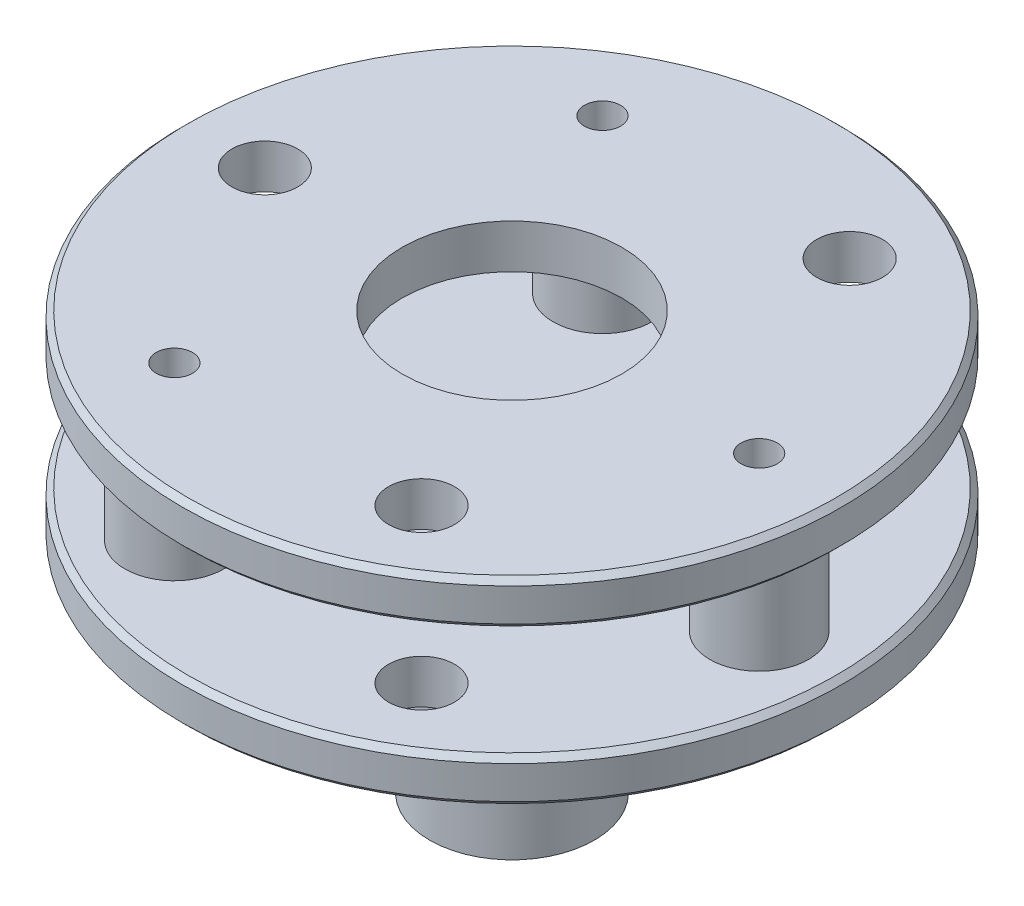
ISO-10303-21;
HEADER;
FILE_DESCRIPTION(('STEP AP214'),'2;1');
FILE_NAME('part.step','',(''),(''),'','','');
FILE_SCHEMA(('AUTOMOTIVE_DESIGN { 1 0 10303 214 1 1 1 1 }'));
ENDSEC;
DATA;
#1=APPLICATION_CONTEXT('core data for automotive mechanical design processes');
#2=APPLICATION_PROTOCOL_DEFINITION('international standard','automotive_design',2000,#1);
#3=PRODUCT_CONTEXT('',#1,'mechanical');
#4=PRODUCT('Part','Part','',(#3));
#5=PRODUCT_RELATED_PRODUCT_CATEGORY('part','',(#4));
#6=PRODUCT_DEFINITION_FORMATION('','',#4);
#7=PRODUCT_DEFINITION_CONTEXT('part definition',#1,'design');
#8=PRODUCT_DEFINITION('design','',#6,#7);
#9=PRODUCT_DEFINITION_SHAPE('','',#8);
#10=(LENGTH_UNIT() NAMED_UNIT(*) SI_UNIT(.MILLI.,.METRE.));
#11=(NAMED_UNIT(*) PLANE_ANGLE_UNIT() SI_UNIT($,.RADIAN.));
#12=(NAMED_UNIT(*) SI_UNIT($,.STERADIAN.) SOLID_ANGLE_UNIT());
#13=UNCERTAINTY_MEASURE_WITH_UNIT(LENGTH_MEASURE(1.E-05),#10,'distance_accuracy_value','');
#14=(GEOMETRIC_REPRESENTATION_CONTEXT(3) GLOBAL_UNCERTAINTY_ASSIGNED_CONTEXT((#13)) GLOBAL_UNIT_ASSIGNED_CONTEXT((#10,
#11,#12)) REPRESENTATION_CONTEXT('',''));
#15=CARTESIAN_POINT('',(0.,0.,0.));
#16=DIRECTION('',(0.,0.,1.));
#17=DIRECTION('',(1.,0.,0.));
#18=AXIS2_PLACEMENT_3D('',#15,#16,#17);
#19=CARTESIAN_POINT('',(-22.5,76.,-38.971143));
#20=DIRECTION('',(0.,-1.,0.));
#21=DIRECTION('',(0.,0.,-1.));
#22=AXIS2_PLACEMENT_3D('',#19,#20,#21);
#23=CYLINDRICAL_SURFACE('',#22,9.);
#24=CARTESIAN_POINT('',(-22.5,48.,-38.971143));
#25=DIRECTION('',(0.,1.,0.));
#26=DIRECTION('',(0.,0.,1.));
#27=AXIS2_PLACEMENT_3D('',#24,#25,#26);
#28=CIRCLE('',#27,9.);
#29=CARTESIAN_POINT('',(-22.5,48.,-29.971143));
#30=VERTEX_POINT('',#29);
#31=EDGE_CURVE('E114',#30,#30,#28,.F.);
#32=ORIENTED_EDGE('',*,*,#31,.F.);
#33=EDGE_LOOP('',(#32));
#34=FACE_BOUND('',#33,.T.);
#35=CARTESIAN_POINT('',(-22.5,68.,-38.971143));
#36=DIRECTION('',(0.,1.,0.));
#37=DIRECTION('',(0.,0.,1.));
#38=AXIS2_PLACEMENT_3D('',#35,#36,#37);
#39=CIRCLE('',#38,9.);
#40=CARTESIAN_POINT('',(-22.5,68.,-29.971143));
#41=VERTEX_POINT('',#40);
#42=EDGE_CURVE('E100',#41,#41,#39,.T.);
#43=ORIENTED_EDGE('',*,*,#42,.F.);
#44=EDGE_LOOP('',(#43));
#45=FACE_BOUND('',#44,.T.);
#46=ADVANCED_FACE('F51',(#34,#45),#23,.T.);
#47=CARTESIAN_POINT('',(-22.5,76.,38.971143));
#48=DIRECTION('',(0.,-1.,0.));
#49=DIRECTION('',(0.,0.,-1.));
#50=AXIS2_PLACEMENT_3D('',#47,#48,#49);
#51=CYLINDRICAL_SURFACE('',#50,9.);
#52=CARTESIAN_POINT('',(-22.5,48.,38.971143));
#53=DIRECTION('',(0.,1.,0.));
#54=DIRECTION('',(0.,0.,1.));
#55=AXIS2_PLACEMENT_3D('',#52,#53,#54);
#56=CIRCLE('',#55,9.);
#57=CARTESIAN_POINT('',(-22.5,48.,47.971143));
#58=VERTEX_POINT('',#57);
#59=EDGE_CURVE('E110',#58,#58,#56,.F.);
#60=ORIENTED_EDGE('',*,*,#59,.F.);
#61=EDGE_LOOP('',(#60));
#62=FACE_BOUND('',#61,.T.);
#63=CARTESIAN_POINT('',(-22.5,68.,38.971143));
#64=DIRECTION('',(0.,1.,0.));
#65=DIRECTION('',(0.,0.,1.));
#66=AXIS2_PLACEMENT_3D('',#63,#64,#65);
#67=CIRCLE('',#66,9.);
#68=CARTESIAN_POINT('',(-22.5,68.,47.971143));
#69=VERTEX_POINT('',#68);
#70=EDGE_CURVE('E105',#69,#69,#67,.T.);
#71=ORIENTED_EDGE('',*,*,#70,.F.);
#72=EDGE_LOOP('',(#71));
#73=FACE_BOUND('',#72,.T.);
#74=ADVANCED_FACE('F230',(#62,#73),#51,.T.);
#75=CARTESIAN_POINT('',(45.,76.,0.));
#76=DIRECTION('',(0.,-1.,0.));
#77=DIRECTION('',(0.,0.,-1.));
#78=AXIS2_PLACEMENT_3D('',#75,#76,#77);
#79=CYLINDRICAL_SURFACE('',#78,9.);
#80=CARTESIAN_POINT('',(45.,48.,0.));
#81=DIRECTION('',(0.,1.,0.));
#82=DIRECTION('',(0.,0.,1.));
#83=AXIS2_PLACEMENT_3D('',#80,#81,#82);
#84=CIRCLE('',#83,9.);
#85=CARTESIAN_POINT('',(45.,48.,9.));
#86=VERTEX_POINT('',#85);
#87=EDGE_CURVE('E106',#86,#86,#84,.F.);
#88=ORIENTED_EDGE('',*,*,#87,.F.);
#89=EDGE_LOOP('',(#88));
#90=FACE_BOUND('',#89,.T.);
#91=CARTESIAN_POINT('',(45.,68.,0.));
#92=DIRECTION('',(0.,1.,0.));
#93=DIRECTION('',(0.,0.,1.));
#94=AXIS2_PLACEMENT_3D('',#91,#92,#93);
#95=CIRCLE('',#94,9.);
#96=CARTESIAN_POINT('',(45.,68.,9.));
#97=VERTEX_POINT('',#96);
#98=EDGE_CURVE('E101',#97,#97,#95,.T.);
#99=ORIENTED_EDGE('',*,*,#98,.F.);
#100=EDGE_LOOP('',(#99));
#101=FACE_BOUND('',#100,.T.);
#102=ADVANCED_FACE('F235',(#90,#101),#79,.T.);
#103=CARTESIAN_POINT('',(0.,48.,0.));
#104=DIRECTION('',(0.,-1.,0.));
#105=DIRECTION('',(0.,0.,-1.));
#106=AXIS2_PLACEMENT_3D('',#103,#104,#105);
#107=CYLINDRICAL_SURFACE('',#106,60.);
#108=CARTESIAN_POINT('',(0.,47.,0.));
#109=DIRECTION('',(0.,1.,0.));
#110=DIRECTION('',(0.,0.,1.));
#111=AXIS2_PLACEMENT_3D('',#108,#109,#110);
#112=CIRCLE('',#111,60.);
#113=CARTESIAN_POINT('',(0.,47.,60.));
#114=VERTEX_POINT('',#113);
#115=EDGE_CURVE('E60',#114,#114,#112,.F.);
#116=ORIENTED_EDGE('',*,*,#115,.T.);
#117=EDGE_LOOP('',(#116));
#118=FACE_BOUND('',#117,.T.);
#119=CARTESIAN_POINT('',(0.,41.,0.));
#120=DIRECTION('',(0.,1.,0.));
#121=DIRECTION('',(0.,0.,1.));
#122=AXIS2_PLACEMENT_3D('',#119,#120,#121);
#123=CIRCLE('',#122,60.);
#124=CARTESIAN_POINT('',(0.,41.,60.));
#125=VERTEX_POINT('',#124);
#126=EDGE_CURVE('E67',#125,#125,#123,.T.);
#127=ORIENTED_EDGE('',*,*,#126,.T.);
#128=EDGE_LOOP('',(#127));
#129=FACE_BOUND('',#128,.T.);
#130=ADVANCED_FACE('F246',(#118,#129),#107,.T.);
#131=CARTESIAN_POINT('',(0.,48.,0.));
#132=DIRECTION('',(0.,1.,0.));
#133=DIRECTION('',(0.,0.,1.));
#134=AXIS2_PLACEMENT_3D('',#131,#132,#133);
#135=PLANE('',#134);
#136=CARTESIAN_POINT('',(0.,48.,0.));
#137=DIRECTION('',(0.,1.,0.));
#138=DIRECTION('',(0.,0.,1.));
#139=AXIS2_PLACEMENT_3D('',#136,#137,#138);
#140=CIRCLE('',#139,59.);
#141=CARTESIAN_POINT('',(0.,48.,59.));
#142=VERTEX_POINT('',#141);
#143=EDGE_CURVE('E74',#142,#142,#140,.T.);
#144=ORIENTED_EDGE('',*,*,#143,.T.);
#145=EDGE_LOOP('',(#144));
#146=FACE_BOUND('',#145,.T.);
#147=CARTESIAN_POINT('',(22.5,48.,38.971143));
#148=DIRECTION('',(0.,1.,0.));
#149=DIRECTION('',(0.,0.,1.));
#150=AXIS2_PLACEMENT_3D('',#147,#148,#149);
#151=CIRCLE('',#150,6.);
#152=CARTESIAN_POINT('',(22.5,48.,44.971143));
#153=VERTEX_POINT('',#152);
#154=EDGE_CURVE('E145',#153,#153,#151,.T.);
#155=ORIENTED_EDGE('',*,*,#154,.F.);
#156=EDGE_LOOP('',(#155));
#157=FACE_BOUND('',#156,.T.);
#158=CARTESIAN_POINT('',(-45.,48.,0.));
#159=DIRECTION('',(0.,1.,0.));
#160=DIRECTION('',(0.,0.,1.));
#161=AXIS2_PLACEMENT_3D('',#158,#159,#160);
#162=CIRCLE('',#161,6.);
#163=CARTESIAN_POINT('',(-45.,48.,6.));
#164=VERTEX_POINT('',#163);
#165=EDGE_CURVE('E163',#164,#164,#162,.T.);
#166=ORIENTED_EDGE('',*,*,#165,.F.);
#167=EDGE_LOOP('',(#166));
#168=FACE_BOUND('',#167,.T.);
#169=CARTESIAN_POINT('',(22.5,48.,-38.971143));
#170=DIRECTION('',(0.,1.,0.));
#171=DIRECTION('',(0.,0.,1.));
#172=AXIS2_PLACEMENT_3D('',#169,#170,#171);
#173=CIRCLE('',#172,6.);
#174=CARTESIAN_POINT('',(22.5,48.,-32.971143));
#175=VERTEX_POINT('',#174);
#176=EDGE_CURVE('E175',#175,#175,#173,.T.);
#177=ORIENTED_EDGE('',*,*,#176,.F.);
#178=EDGE_LOOP('',(#177));
#179=FACE_BOUND('',#178,.T.);
#180=ORIENTED_EDGE('',*,*,#87,.T.);
#181=EDGE_LOOP('',(#180));
#182=FACE_BOUND('',#181,.T.);
#183=ORIENTED_EDGE('',*,*,#59,.T.);
#184=EDGE_LOOP('',(#183));
#185=FACE_BOUND('',#184,.T.);
#186=ORIENTED_EDGE('',*,*,#31,.T.);
#187=EDGE_LOOP('',(#186));
#188=FACE_BOUND('',#187,.T.);
#189=ADVANCED_FACE('F242',(#146,#157,#168,#179,#182,#185,#188),#135,.T.);
#190=CARTESIAN_POINT('',(0.,40.,0.));
#191=DIRECTION('',(0.,1.,0.));
#192=DIRECTION('',(0.,0.,1.));
#193=AXIS2_PLACEMENT_3D('',#190,#191,#192);
#194=PLANE('',#193);
#195=CARTESIAN_POINT('',(0.,40.,0.));
#196=DIRECTION('',(0.,1.,0.));
#197=DIRECTION('',(0.,0.,1.));
#198=AXIS2_PLACEMENT_3D('',#195,#196,#197);
#199=CIRCLE('',#198,59.);
#200=CARTESIAN_POINT('',(0.,40.,59.));
#201=VERTEX_POINT('',#200);
#202=EDGE_CURVE('E10',#201,#201,#199,.F.);
#203=ORIENTED_EDGE('',*,*,#202,.T.);
#204=EDGE_LOOP('',(#203));
#205=FACE_BOUND('',#204,.T.);
#206=CARTESIAN_POINT('',(22.5,40.,38.971143));
#207=DIRECTION('',(0.,1.,0.));
#208=DIRECTION('',(0.,0.,1.));
#209=AXIS2_PLACEMENT_3D('',#206,#207,#208);
#210=CIRCLE('',#209,6.);
#211=CARTESIAN_POINT('',(22.5,40.,44.971143));
#212=VERTEX_POINT('',#211);
#213=EDGE_CURVE('E155',#212,#212,#210,.T.);
#214=ORIENTED_EDGE('',*,*,#213,.T.);
#215=EDGE_LOOP('',(#214));
#216=FACE_BOUND('',#215,.T.);
#217=CARTESIAN_POINT('',(-45.,40.,0.));
#218=DIRECTION('',(0.,1.,0.));
#219=DIRECTION('',(0.,0.,1.));
#220=AXIS2_PLACEMENT_3D('',#217,#218,#219);
#221=CIRCLE('',#220,6.);
#222=CARTESIAN_POINT('',(-45.,40.,6.));
#223=VERTEX_POINT('',#222);
#224=EDGE_CURVE('E167',#223,#223,#221,.T.);
#225=ORIENTED_EDGE('',*,*,#224,.T.);
#226=EDGE_LOOP('',(#225));
#227=FACE_BOUND('',#226,.T.);
#228=CARTESIAN_POINT('',(22.5,40.,-38.971143));
#229=DIRECTION('',(0.,1.,0.));
#230=DIRECTION('',(0.,0.,1.));
#231=AXIS2_PLACEMENT_3D('',#228,#229,#230);
#232=CIRCLE('',#231,6.);
#233=CARTESIAN_POINT('',(22.5,40.,-32.971143));
#234=VERTEX_POINT('',#233);
#235=EDGE_CURVE('E179',#234,#234,#232,.T.);
#236=ORIENTED_EDGE('',*,*,#235,.T.);
#237=EDGE_LOOP('',(#236));
#238=FACE_BOUND('',#237,.T.);
#239=CARTESIAN_POINT('',(45.,40.,0.));
#240=DIRECTION('',(0.,1.,0.));
#241=DIRECTION('',(0.,0.,1.));
#242=AXIS2_PLACEMENT_3D('',#239,#240,#241);
#243=CIRCLE('',#242,3.3);
#244=CARTESIAN_POINT('',(45.,40.,3.3));
#245=VERTEX_POINT('',#244);
#246=EDGE_CURVE('E128',#245,#245,#243,.T.);
#247=ORIENTED_EDGE('',*,*,#246,.T.);
#248=EDGE_LOOP('',(#247));
#249=FACE_BOUND('',#248,.T.);
#250=CARTESIAN_POINT('',(-22.5,40.,38.971143));
#251=DIRECTION('',(0.,1.,0.));
#252=DIRECTION('',(0.,0.,1.));
#253=AXIS2_PLACEMENT_3D('',#250,#251,#252);
#254=CIRCLE('',#253,3.3);
#255=CARTESIAN_POINT('',(-22.5,40.,42.271143));
#256=VERTEX_POINT('',#255);
#257=EDGE_CURVE('E132',#256,#256,#254,.T.);
#258=ORIENTED_EDGE('',*,*,#257,.T.);
#259=EDGE_LOOP('',(#258));
#260=FACE_BOUND('',#259,.T.);
#261=CARTESIAN_POINT('',(-22.5,40.,-38.971143));
#262=DIRECTION('',(0.,1.,0.));
#263=DIRECTION('',(0.,0.,1.));
#264=AXIS2_PLACEMENT_3D('',#261,#262,#263);
#265=CIRCLE('',#264,3.3);
#266=CARTESIAN_POINT('',(-22.5,40.,-35.671143));
#267=VERTEX_POINT('',#266);
#268=EDGE_CURVE('E136',#267,#267,#265,.T.);
#269=ORIENTED_EDGE('',*,*,#268,.T.);
#270=EDGE_LOOP('',(#269));
#271=FACE_BOUND('',#270,.T.);
#272=CARTESIAN_POINT('',(0.,40.,0.));
#273=DIRECTION('',(0.,1.,0.));
#274=DIRECTION('',(0.,0.,1.));
#275=AXIS2_PLACEMENT_3D('',#272,#273,#274);
#276=CIRCLE('',#275,15.);
#277=CARTESIAN_POINT('',(0.,40.,15.));
#278=VERTEX_POINT('',#277);
#279=EDGE_CURVE('E96',#278,#278,#276,.F.);
#280=ORIENTED_EDGE('',*,*,#279,.F.);
#281=EDGE_LOOP('',(#280));
#282=FACE_BOUND('',#281,.T.);
#283=ADVANCED_FACE('F245',(#205,#216,#227,#238,#249,#260,#271,#282),#194,.F.);
#284=CARTESIAN_POINT('',(0.,76.,0.));
#285=DIRECTION('',(0.,-1.,0.));
#286=DIRECTION('',(0.,0.,-1.));
#287=AXIS2_PLACEMENT_3D('',#284,#285,#286);
#288=CYLINDRICAL_SURFACE('',#287,60.);
#289=CARTESIAN_POINT('',(0.,75.,0.));
#290=DIRECTION('',(0.,1.,0.));
#291=DIRECTION('',(0.,0.,1.));
#292=AXIS2_PLACEMENT_3D('',#289,#290,#291);
#293=CIRCLE('',#292,60.);
#294=CARTESIAN_POINT('',(0.,75.,60.));
#295=VERTEX_POINT('',#294);
#296=EDGE_CURVE('E84',#295,#295,#293,.F.);
#297=ORIENTED_EDGE('',*,*,#296,.T.);
#298=EDGE_LOOP('',(#297));
#299=FACE_BOUND('',#298,.T.);
#300=CARTESIAN_POINT('',(0.,69.,0.));
#301=DIRECTION('',(0.,1.,0.));
#302=DIRECTION('',(0.,0.,1.));
#303=AXIS2_PLACEMENT_3D('',#300,#301,#302);
#304=CIRCLE('',#303,60.);
#305=CARTESIAN_POINT('',(0.,69.,60.));
#306=VERTEX_POINT('',#305);
#307=EDGE_CURVE('E88',#306,#306,#304,.T.);
#308=ORIENTED_EDGE('',*,*,#307,.T.);
#309=EDGE_LOOP('',(#308));
#310=FACE_BOUND('',#309,.T.);
#311=ADVANCED_FACE('F250',(#299,#310),#288,.T.);
#312=CARTESIAN_POINT('',(0.,68.,0.));
#313=DIRECTION('',(0.,1.,0.));
#314=DIRECTION('',(0.,0.,1.));
#315=AXIS2_PLACEMENT_3D('',#312,#313,#314);
#316=PLANE('',#315);
#317=CARTESIAN_POINT('',(0.,68.,0.));
#318=DIRECTION('',(0.,1.,0.));
#319=DIRECTION('',(0.,0.,1.));
#320=AXIS2_PLACEMENT_3D('',#317,#318,#319);
#321=CIRCLE('',#320,59.);
#322=CARTESIAN_POINT('',(0.,68.,59.));
#323=VERTEX_POINT('',#322);
#324=EDGE_CURVE('E80',#323,#323,#321,.F.);
#325=ORIENTED_EDGE('',*,*,#324,.T.);
#326=EDGE_LOOP('',(#325));
#327=FACE_BOUND('',#326,.T.);
#328=CARTESIAN_POINT('',(0.,68.,0.));
#329=DIRECTION('',(0.,1.,0.));
#330=DIRECTION('',(0.,0.,1.));
#331=AXIS2_PLACEMENT_3D('',#328,#329,#330);
#332=CIRCLE('',#331,20.);
#333=CARTESIAN_POINT('',(0.,68.,20.));
#334=VERTEX_POINT('',#333);
#335=EDGE_CURVE('E192',#334,#334,#332,.T.);
#336=ORIENTED_EDGE('',*,*,#335,.T.);
#337=EDGE_LOOP('',(#336));
#338=FACE_BOUND('',#337,.T.);
#339=CARTESIAN_POINT('',(22.5,68.,38.971143));
#340=DIRECTION('',(0.,1.,0.));
#341=DIRECTION('',(0.,0.,1.));
#342=AXIS2_PLACEMENT_3D('',#339,#340,#341);
#343=CIRCLE('',#342,6.);
#344=CARTESIAN_POINT('',(22.5,68.,44.971143));
#345=VERTEX_POINT('',#344);
#346=EDGE_CURVE('E159',#345,#345,#343,.T.);
#347=ORIENTED_EDGE('',*,*,#346,.T.);
#348=EDGE_LOOP('',(#347));
#349=FACE_BOUND('',#348,.T.);
#350=CARTESIAN_POINT('',(-45.,68.,0.));
#351=DIRECTION('',(0.,1.,0.));
#352=DIRECTION('',(0.,0.,1.));
#353=AXIS2_PLACEMENT_3D('',#350,#351,#352);
#354=CIRCLE('',#353,6.);
#355=CARTESIAN_POINT('',(-45.,68.,6.));
#356=VERTEX_POINT('',#355);
#357=EDGE_CURVE('E171',#356,#356,#354,.T.);
#358=ORIENTED_EDGE('',*,*,#357,.T.);
#359=EDGE_LOOP('',(#358));
#360=FACE_BOUND('',#359,.T.);
#361=CARTESIAN_POINT('',(22.5,68.,-38.971143));
#362=DIRECTION('',(0.,1.,0.));
#363=DIRECTION('',(0.,0.,1.));
#364=AXIS2_PLACEMENT_3D('',#361,#362,#363);
#365=CIRCLE('',#364,6.);
#366=CARTESIAN_POINT('',(22.5,68.,-32.971143));
#367=VERTEX_POINT('',#366);
#368=EDGE_CURVE('E183',#367,#367,#365,.T.);
#369=ORIENTED_EDGE('',*,*,#368,.T.);
#370=EDGE_LOOP('',(#369));
#371=FACE_BOUND('',#370,.T.);
#372=ORIENTED_EDGE('',*,*,#42,.T.);
#373=EDGE_LOOP('',(#372));
#374=FACE_BOUND('',#373,.T.);
#375=ORIENTED_EDGE('',*,*,#70,.T.);
#376=EDGE_LOOP('',(#375));
#377=FACE_BOUND('',#376,.T.);
#378=ORIENTED_EDGE('',*,*,#98,.T.);
#379=EDGE_LOOP('',(#378));
#380=FACE_BOUND('',#379,.T.);
#381=ADVANCED_FACE('F283',(#327,#338,#349,#360,#371,#374,#377,#380),#316,.F.);
#382=CARTESIAN_POINT('',(45.,76.,0.));
#383=DIRECTION('',(0.,1.,0.));
#384=DIRECTION('',(0.,0.,1.));
#385=AXIS2_PLACEMENT_3D('',#382,#383,#384);
#386=PLANE('',#385);
#387=CARTESIAN_POINT('',(0.,76.,0.));
#388=DIRECTION('',(0.,1.,0.));
#389=DIRECTION('',(0.,0.,1.));
#390=AXIS2_PLACEMENT_3D('',#387,#388,#389);
#391=CIRCLE('',#390,59.);
#392=CARTESIAN_POINT('',(0.,76.,59.));
#393=VERTEX_POINT('',#392);
#394=EDGE_CURVE('E92',#393,#393,#391,.T.);
#395=ORIENTED_EDGE('',*,*,#394,.T.);
#396=EDGE_LOOP('',(#395));
#397=FACE_BOUND('',#396,.T.);
#398=CARTESIAN_POINT('',(0.,76.,0.));
#399=DIRECTION('',(0.,1.,0.));
#400=DIRECTION('',(0.,0.,1.));
#401=AXIS2_PLACEMENT_3D('',#398,#399,#400);
#402=CIRCLE('',#401,20.);
#403=CARTESIAN_POINT('',(0.,76.,20.));
#404=VERTEX_POINT('',#403);
#405=EDGE_CURVE('E199',#404,#404,#402,.T.);
#406=ORIENTED_EDGE('',*,*,#405,.F.);
#407=EDGE_LOOP('',(#406));
#408=FACE_BOUND('',#407,.T.);
#409=CARTESIAN_POINT('',(22.5,76.,38.971143));
#410=DIRECTION('',(0.,1.,0.));
#411=DIRECTION('',(0.,0.,1.));
#412=AXIS2_PLACEMENT_3D('',#409,#410,#411);
#413=CIRCLE('',#412,6.);
#414=CARTESIAN_POINT('',(22.5,76.,44.971143));
#415=VERTEX_POINT('',#414);
#416=EDGE_CURVE('E186',#415,#415,#413,.T.);
#417=ORIENTED_EDGE('',*,*,#416,.F.);
#418=EDGE_LOOP('',(#417));
#419=FACE_BOUND('',#418,.T.);
#420=CARTESIAN_POINT('',(-45.,76.,0.));
#421=DIRECTION('',(0.,1.,0.));
#422=DIRECTION('',(0.,0.,1.));
#423=AXIS2_PLACEMENT_3D('',#420,#421,#422);
#424=CIRCLE('',#423,6.);
#425=CARTESIAN_POINT('',(-45.,76.,6.));
#426=VERTEX_POINT('',#425);
#427=EDGE_CURVE('E191',#426,#426,#424,.T.);
#428=ORIENTED_EDGE('',*,*,#427,.F.);
#429=EDGE_LOOP('',(#428));
#430=FACE_BOUND('',#429,.T.);
#431=CARTESIAN_POINT('',(22.5,76.,-38.971143));
#432=DIRECTION('',(0.,1.,0.));
#433=DIRECTION('',(0.,0.,1.));
#434=AXIS2_PLACEMENT_3D('',#431,#432,#433);
#435=CIRCLE('',#434,6.);
#436=CARTESIAN_POINT('',(22.5,76.,-32.971143));
#437=VERTEX_POINT('',#436);
#438=EDGE_CURVE('E187',#437,#437,#435,.T.);
#439=ORIENTED_EDGE('',*,*,#438,.F.);
#440=EDGE_LOOP('',(#439));
#441=FACE_BOUND('',#440,.T.);
#442=CARTESIAN_POINT('',(45.,76.,0.));
#443=DIRECTION('',(0.,1.,0.));
#444=DIRECTION('',(0.,0.,1.));
#445=AXIS2_PLACEMENT_3D('',#442,#443,#444);
#446=CIRCLE('',#445,3.3);
#447=CARTESIAN_POINT('',(45.,76.,3.3));
#448=VERTEX_POINT('',#447);
#449=EDGE_CURVE('E139',#448,#448,#446,.T.);
#450=ORIENTED_EDGE('',*,*,#449,.F.);
#451=EDGE_LOOP('',(#450));
#452=FACE_BOUND('',#451,.T.);
#453=CARTESIAN_POINT('',(-22.5,76.,38.971143));
#454=DIRECTION('',(0.,1.,0.));
#455=DIRECTION('',(0.,0.,1.));
#456=AXIS2_PLACEMENT_3D('',#453,#454,#455);
#457=CIRCLE('',#456,3.3);
#458=CARTESIAN_POINT('',(-22.5,76.,42.271143));
#459=VERTEX_POINT('',#458);
#460=EDGE_CURVE('E144',#459,#459,#457,.T.);
#461=ORIENTED_EDGE('',*,*,#460,.F.);
#462=EDGE_LOOP('',(#461));
#463=FACE_BOUND('',#462,.T.);
#464=CARTESIAN_POINT('',(-22.5,76.,-38.971143));
#465=DIRECTION('',(0.,1.,0.));
#466=DIRECTION('',(0.,0.,1.));
#467=AXIS2_PLACEMENT_3D('',#464,#465,#466);
#468=CIRCLE('',#467,3.3);
#469=CARTESIAN_POINT('',(-22.5,76.,-35.671143));
#470=VERTEX_POINT('',#469);
#471=EDGE_CURVE('E140',#470,#470,#468,.T.);
#472=ORIENTED_EDGE('',*,*,#471,.F.);
#473=EDGE_LOOP('',(#472));
#474=FACE_BOUND('',#473,.T.);
#475=ADVANCED_FACE('F286',(#397,#408,#419,#430,#441,#452,#463,#474),#386,.T.);
#476=CARTESIAN_POINT('',(0.,48.,0.));
#477=DIRECTION('',(0.,-1.,0.));
#478=DIRECTION('',(0.,0.,-1.));
#479=AXIS2_PLACEMENT_3D('',#476,#477,#478);
#480=CYLINDRICAL_SURFACE('',#479,15.);
#481=CARTESIAN_POINT('',(0.,0.,0.));
#482=DIRECTION('',(0.,1.,0.));
#483=DIRECTION('',(0.,0.,1.));
#484=AXIS2_PLACEMENT_3D('',#481,#482,#483);
#485=CIRCLE('',#484,15.);
#486=CARTESIAN_POINT('',(0.,0.,15.));
#487=VERTEX_POINT('',#486);
#488=EDGE_CURVE('E118',#487,#487,#485,.T.);
#489=ORIENTED_EDGE('',*,*,#488,.T.);
#490=EDGE_LOOP('',(#489));
#491=FACE_BOUND('',#490,.T.);
#492=ORIENTED_EDGE('',*,*,#279,.T.);
#493=EDGE_LOOP('',(#492));
#494=FACE_BOUND('',#493,.T.);
#495=ADVANCED_FACE('F297',(#491,#494),#480,.T.);
#496=CARTESIAN_POINT('',(0.,0.,0.));
#497=DIRECTION('',(0.,1.,0.));
#498=DIRECTION('',(0.,0.,1.));
#499=AXIS2_PLACEMENT_3D('',#496,#497,#498);
#500=PLANE('',#499);
#501=CARTESIAN_POINT('',(0.,0.,0.));
#502=DIRECTION('',(0.,1.,0.));
#503=DIRECTION('',(0.,0.,1.));
#504=AXIS2_PLACEMENT_3D('',#501,#502,#503);
#505=CIRCLE('',#504,4.25);
#506=CARTESIAN_POINT('',(0.,0.,4.25));
#507=VERTEX_POINT('',#506);
#508=EDGE_CURVE('E206',#507,#507,#505,.T.);
#509=ORIENTED_EDGE('',*,*,#508,.T.);
#510=EDGE_LOOP('',(#509));
#511=FACE_BOUND('',#510,.T.);
#512=ORIENTED_EDGE('',*,*,#488,.F.);
#513=EDGE_LOOP('',(#512));
#514=FACE_BOUND('',#513,.T.);
#515=ADVANCED_FACE('F304',(#511,#514),#500,.F.);
#516=CARTESIAN_POINT('',(-22.5,0.,-38.971143));
#517=DIRECTION('',(0.,1.,0.));
#518=DIRECTION('',(0.,0.,1.));
#519=AXIS2_PLACEMENT_3D('',#516,#517,#518);
#520=CYLINDRICAL_SURFACE('',#519,3.3);
#521=ORIENTED_EDGE('',*,*,#471,.T.);
#522=EDGE_LOOP('',(#521));
#523=FACE_BOUND('',#522,.T.);
#524=ORIENTED_EDGE('',*,*,#268,.F.);
#525=EDGE_LOOP('',(#524));
#526=FACE_BOUND('',#525,.T.);
#527=ADVANCED_FACE('F308',(#523,#526),#520,.F.);
#528=CARTESIAN_POINT('',(-22.5,0.,38.971143));
#529=DIRECTION('',(0.,1.,0.));
#530=DIRECTION('',(0.,0.,1.));
#531=AXIS2_PLACEMENT_3D('',#528,#529,#530);
#532=CYLINDRICAL_SURFACE('',#531,3.3);
#533=ORIENTED_EDGE('',*,*,#460,.T.);
#534=EDGE_LOOP('',(#533));
#535=FACE_BOUND('',#534,.T.);
#536=ORIENTED_EDGE('',*,*,#257,.F.);
#537=EDGE_LOOP('',(#536));
#538=FACE_BOUND('',#537,.T.);
#539=ADVANCED_FACE('F312',(#535,#538),#532,.F.);
#540=CARTESIAN_POINT('',(45.,0.,0.));
#541=DIRECTION('',(0.,1.,0.));
#542=DIRECTION('',(0.,0.,1.));
#543=AXIS2_PLACEMENT_3D('',#540,#541,#542);
#544=CYLINDRICAL_SURFACE('',#543,3.3);
#545=ORIENTED_EDGE('',*,*,#449,.T.);
#546=EDGE_LOOP('',(#545));
#547=FACE_BOUND('',#546,.T.);
#548=ORIENTED_EDGE('',*,*,#246,.F.);
#549=EDGE_LOOP('',(#548));
#550=FACE_BOUND('',#549,.T.);
#551=ADVANCED_FACE('F316',(#547,#550),#544,.F.);
#552=CARTESIAN_POINT('',(22.5,0.,-38.971143));
#553=DIRECTION('',(0.,1.,0.));
#554=DIRECTION('',(0.,0.,1.));
#555=AXIS2_PLACEMENT_3D('',#552,#553,#554);
#556=CYLINDRICAL_SURFACE('',#555,6.);
#557=ORIENTED_EDGE('',*,*,#438,.T.);
#558=EDGE_LOOP('',(#557));
#559=FACE_BOUND('',#558,.T.);
#560=ORIENTED_EDGE('',*,*,#368,.F.);
#561=EDGE_LOOP('',(#560));
#562=FACE_BOUND('',#561,.T.);
#563=ADVANCED_FACE('F320',(#559,#562),#556,.F.);
#564=CARTESIAN_POINT('',(-45.,0.,0.));
#565=DIRECTION('',(0.,1.,0.));
#566=DIRECTION('',(0.,0.,1.));
#567=AXIS2_PLACEMENT_3D('',#564,#565,#566);
#568=CYLINDRICAL_SURFACE('',#567,6.);
#569=ORIENTED_EDGE('',*,*,#427,.T.);
#570=EDGE_LOOP('',(#569));
#571=FACE_BOUND('',#570,.T.);
#572=ORIENTED_EDGE('',*,*,#357,.F.);
#573=EDGE_LOOP('',(#572));
#574=FACE_BOUND('',#573,.T.);
#575=ADVANCED_FACE('F332',(#571,#574),#568,.F.);
#576=CARTESIAN_POINT('',(22.5,0.,38.971143));
#577=DIRECTION('',(0.,1.,0.));
#578=DIRECTION('',(0.,0.,1.));
#579=AXIS2_PLACEMENT_3D('',#576,#577,#578);
#580=CYLINDRICAL_SURFACE('',#579,6.);
#581=ORIENTED_EDGE('',*,*,#416,.T.);
#582=EDGE_LOOP('',(#581));
#583=FACE_BOUND('',#582,.T.);
#584=ORIENTED_EDGE('',*,*,#346,.F.);
#585=EDGE_LOOP('',(#584));
#586=FACE_BOUND('',#585,.T.);
#587=ADVANCED_FACE('F326',(#583,#586),#580,.F.);
#588=ORIENTED_EDGE('',*,*,#176,.T.);
#589=EDGE_LOOP('',(#588));
#590=FACE_BOUND('',#589,.T.);
#591=ORIENTED_EDGE('',*,*,#235,.F.);
#592=EDGE_LOOP('',(#591));
#593=FACE_BOUND('',#592,.T.);
#594=ADVANCED_FACE('F322',(#590,#593),#556,.F.);
#595=ORIENTED_EDGE('',*,*,#165,.T.);
#596=EDGE_LOOP('',(#595));
#597=FACE_BOUND('',#596,.T.);
#598=ORIENTED_EDGE('',*,*,#224,.F.);
#599=EDGE_LOOP('',(#598));
#600=FACE_BOUND('',#599,.T.);
#601=ADVANCED_FACE('F325',(#597,#600),#568,.F.);
#602=ORIENTED_EDGE('',*,*,#154,.T.);
#603=EDGE_LOOP('',(#602));
#604=FACE_BOUND('',#603,.T.);
#605=ORIENTED_EDGE('',*,*,#213,.F.);
#606=EDGE_LOOP('',(#605));
#607=FACE_BOUND('',#606,.T.);
#608=ADVANCED_FACE('F330',(#604,#607),#580,.F.);
#609=CARTESIAN_POINT('',(0.,68.,0.));
#610=DIRECTION('',(0.,1.,0.));
#611=DIRECTION('',(0.,0.,1.));
#612=AXIS2_PLACEMENT_3D('',#609,#610,#611);
#613=CYLINDRICAL_SURFACE('',#612,20.);
#614=ORIENTED_EDGE('',*,*,#335,.F.);
#615=EDGE_LOOP('',(#614));
#616=FACE_BOUND('',#615,.T.);
#617=ORIENTED_EDGE('',*,*,#405,.T.);
#618=EDGE_LOOP('',(#617));
#619=FACE_BOUND('',#618,.T.);
#620=ADVANCED_FACE('F226',(#616,#619),#613,.F.);
#621=CARTESIAN_POINT('',(0.,20.,0.));
#622=DIRECTION('',(0.,-1.,0.));
#623=DIRECTION('',(0.,0.,-1.));
#624=AXIS2_PLACEMENT_3D('',#621,#622,#623);
#625=CYLINDRICAL_SURFACE('',#624,4.25);
#626=CARTESIAN_POINT('',(0.,20.,0.));
#627=DIRECTION('',(0.,1.,0.));
#628=DIRECTION('',(0.,0.,1.));
#629=AXIS2_PLACEMENT_3D('',#626,#627,#628);
#630=CIRCLE('',#629,4.25);
#631=CARTESIAN_POINT('',(0.,20.,4.25));
#632=VERTEX_POINT('',#631);
#633=EDGE_CURVE('E203',#632,#632,#630,.T.);
#634=ORIENTED_EDGE('',*,*,#633,.T.);
#635=EDGE_LOOP('',(#634));
#636=FACE_BOUND('',#635,.T.);
#637=ORIENTED_EDGE('',*,*,#508,.F.);
#638=EDGE_LOOP('',(#637));
#639=FACE_BOUND('',#638,.T.);
#640=ADVANCED_FACE('F213',(#636,#639),#625,.F.);
#641=CARTESIAN_POINT('',(0.,20.,0.));
#642=DIRECTION('',(0.,1.,0.));
#643=DIRECTION('',(0.,0.,1.));
#644=AXIS2_PLACEMENT_3D('',#641,#642,#643);
#645=PLANE('',#644);
#646=ORIENTED_EDGE('',*,*,#633,.F.);
#647=EDGE_LOOP('',(#646));
#648=FACE_BOUND('',#647,.T.);
#649=ADVANCED_FACE('F216',(#648),#645,.F.);
#650=CARTESIAN_POINT('',(0.,76.,0.));
#651=DIRECTION('',(0.,-1.,0.));
#652=DIRECTION('',(0.,0.,-1.));
#653=AXIS2_PLACEMENT_3D('',#650,#651,#652);
#654=CONICAL_SURFACE('',#653,59.,0.785398163397448);
#655=ORIENTED_EDGE('',*,*,#296,.F.);
#656=EDGE_LOOP('',(#655));
#657=FACE_BOUND('',#656,.T.);
#658=ORIENTED_EDGE('',*,*,#394,.F.);
#659=EDGE_LOOP('',(#658));
#660=FACE_BOUND('',#659,.T.);
#661=ADVANCED_FACE('F218',(#657,#660),#654,.T.);
#662=CARTESIAN_POINT('',(0.,69.,0.));
#663=DIRECTION('',(0.,1.,0.));
#664=DIRECTION('',(0.,0.,1.));
#665=AXIS2_PLACEMENT_3D('',#662,#663,#664);
#666=CONICAL_SURFACE('',#665,60.,0.785398163397448);
#667=ORIENTED_EDGE('',*,*,#324,.F.);
#668=EDGE_LOOP('',(#667));
#669=FACE_BOUND('',#668,.T.);
#670=ORIENTED_EDGE('',*,*,#307,.F.);
#671=EDGE_LOOP('',(#670));
#672=FACE_BOUND('',#671,.T.);
#673=ADVANCED_FACE('F223',(#669,#672),#666,.T.);
#674=CARTESIAN_POINT('',(0.,48.,0.));
#675=DIRECTION('',(0.,-1.,0.));
#676=DIRECTION('',(0.,0.,-1.));
#677=AXIS2_PLACEMENT_3D('',#674,#675,#676);
#678=CONICAL_SURFACE('',#677,59.,0.785398163397452);
#679=ORIENTED_EDGE('',*,*,#115,.F.);
#680=EDGE_LOOP('',(#679));
#681=FACE_BOUND('',#680,.T.);
#682=ORIENTED_EDGE('',*,*,#143,.F.);
#683=EDGE_LOOP('',(#682));
#684=FACE_BOUND('',#683,.T.);
#685=ADVANCED_FACE('F259',(#681,#684),#678,.T.);
#686=CARTESIAN_POINT('',(0.,41.,0.));
#687=DIRECTION('',(0.,1.,0.));
#688=DIRECTION('',(0.,0.,1.));
#689=AXIS2_PLACEMENT_3D('',#686,#687,#688);
#690=CONICAL_SURFACE('',#689,60.,0.785398163397452);
#691=ORIENTED_EDGE('',*,*,#202,.F.);
#692=EDGE_LOOP('',(#691));
#693=FACE_BOUND('',#692,.T.);
#694=ORIENTED_EDGE('',*,*,#126,.F.);
#695=EDGE_LOOP('',(#694));
#696=FACE_BOUND('',#695,.T.);
#697=ADVANCED_FACE('F54',(#693,#696),#690,.T.);
#698=CLOSED_SHELL('',(#46,#74,#102,#130,#189,#283,#311,#381,#475,#495,#515,#527,#539,#551,#563,
#575,#587,#594,#601,#608,#620,#640,#649,#661,#673,#685,#697));
#699=MANIFOLD_SOLID_BREP('B2',#698);
#700=ADVANCED_BREP_SHAPE_REPRESENTATION('',(#18,#699),#14);
#701=SHAPE_DEFINITION_REPRESENTATION(#9,#700);
ENDSEC;
END-ISO-10303-21;
